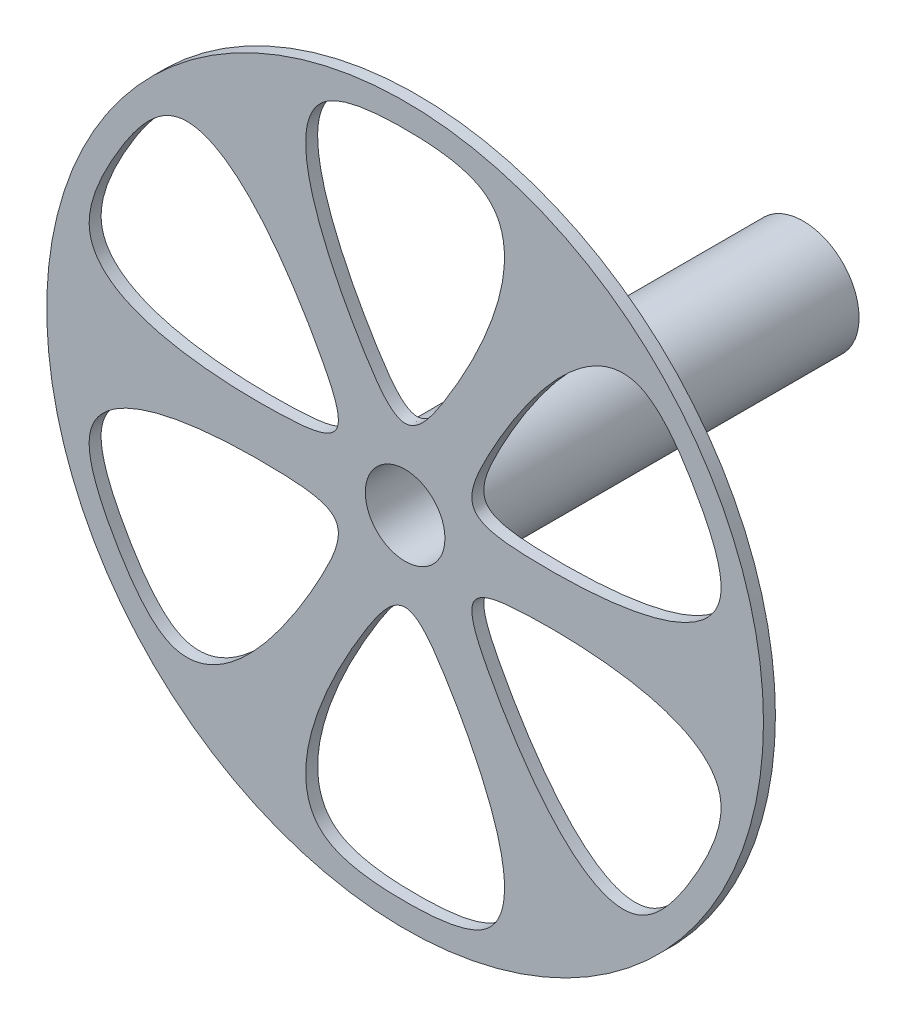
ISO-10303-21;
HEADER;
FILE_DESCRIPTION(('STEP AP214'),'2;1');
FILE_NAME('part.step','',(''),(''),'','','');
FILE_SCHEMA(('AUTOMOTIVE_DESIGN { 1 0 10303 214 1 1 1 1 }'));
ENDSEC;
DATA;
#1=APPLICATION_CONTEXT('core data for automotive mechanical design processes');
#2=APPLICATION_PROTOCOL_DEFINITION('international standard','automotive_design',2000,#1);
#3=PRODUCT_CONTEXT('',#1,'mechanical');
#4=PRODUCT('Part','Part','',(#3));
#5=PRODUCT_RELATED_PRODUCT_CATEGORY('part','',(#4));
#6=PRODUCT_DEFINITION_FORMATION('','',#4);
#7=PRODUCT_DEFINITION_CONTEXT('part definition',#1,'design');
#8=PRODUCT_DEFINITION('design','',#6,#7);
#9=PRODUCT_DEFINITION_SHAPE('','',#8);
#10=(LENGTH_UNIT() NAMED_UNIT(*) SI_UNIT(.MILLI.,.METRE.));
#11=(NAMED_UNIT(*) PLANE_ANGLE_UNIT() SI_UNIT($,.RADIAN.));
#12=(NAMED_UNIT(*) SI_UNIT($,.STERADIAN.) SOLID_ANGLE_UNIT());
#13=UNCERTAINTY_MEASURE_WITH_UNIT(LENGTH_MEASURE(1.E-05),#10,'distance_accuracy_value','');
#14=(GEOMETRIC_REPRESENTATION_CONTEXT(3) GLOBAL_UNCERTAINTY_ASSIGNED_CONTEXT((#13)) GLOBAL_UNIT_ASSIGNED_CONTEXT((#10,
#11,#12)) REPRESENTATION_CONTEXT('',''));
#15=CARTESIAN_POINT('',(0.,0.,0.));
#16=DIRECTION('',(0.,0.,1.));
#17=DIRECTION('',(1.,0.,0.));
#18=AXIS2_PLACEMENT_3D('',#15,#16,#17);
#19=CARTESIAN_POINT('',(0.,0.,1.5));
#20=DIRECTION('',(0.,0.,1.));
#21=DIRECTION('',(1.,0.,0.));
#22=AXIS2_PLACEMENT_3D('',#19,#20,#21);
#23=PLANE('',#22);
#24=CARTESIAN_POINT('',(-10.4903810567667,-11.8301270189221,1.5));
#25=CARTESIAN_POINT('',(-9.05477046402168,-9.13911477379897,1.5));
#26=CARTESIAN_POINT('',(-6.57207744656679,-3.79439068291032,1.5));
#27=CARTESIAN_POINT('',(-23.0244078505378,-2.33053790081409,1.5));
#28=CARTESIAN_POINT('',(-43.9299827972438,-5.17744423737369,1.5));
#29=CARTESIAN_POINT('',(-36.7112614569157,-21.1952566844406,1.5));
#30=CARTESIAN_POINT('',(-26.4487896348655,-35.4557589715392,1.5));
#31=CARTESIAN_POINT('',(-15.6665486605081,-21.532709651615,1.5));
#32=CARTESIAN_POINT('',(-10.4903810567667,-11.8301270189221,1.5));
#33=B_SPLINE_CURVE_WITH_KNOTS('',3,(#24,#25,#26,#27,#28,#29,#30,#31,#32),.UNSPECIFIED.,.T.,.F.,
(4,1,1,1,1,1,4),(0.,0.0826750773212742,0.165350154642548,0.463439385127353,0.582675077321274,
0.701910769515196,1.),.UNSPECIFIED.);
#34=CARTESIAN_POINT('',(-10.4903810567667,-11.8301270189221,1.5));
#35=VERTEX_POINT('',#34);
#36=EDGE_CURVE('E135',#35,#35,#33,.T.);
#37=ORIENTED_EDGE('',*,*,#36,.F.);
#38=EDGE_LOOP('',(#37));
#39=FACE_BOUND('',#38,.T.);
#40=CARTESIAN_POINT('',(15.4903810567666,-3.16987298107788,1.5));
#41=CARTESIAN_POINT('',(12.4420907942224,-3.27210386038024,1.5));
#42=CARTESIAN_POINT('',(6.57207744656673,-3.79439068291042,1.5));
#43=CARTESIAN_POINT('',(13.5305089518564,-18.7744531552525,1.5));
#44=CARTESIAN_POINT('',(26.448789634865,-35.4557589715396,1.5));
#45=CARTESIAN_POINT('',(36.7112614569155,-21.1952566844411,1.5));
#46=CARTESIAN_POINT('',(43.9299827972438,-5.1774442373743,1.5));
#47=CARTESIAN_POINT('',(26.481147900867,-2.80127430381743,1.5));
#48=CARTESIAN_POINT('',(15.4903810567666,-3.16987298107788,1.5));
#49=B_SPLINE_CURVE_WITH_KNOTS('',3,(#40,#41,#42,#43,#44,#45,#46,#47,#48),.UNSPECIFIED.,.T.,.F.,
(4,1,1,1,1,1,4),(0.,0.0826750773212742,0.165350154642548,0.463439385127353,0.582675077321274,
0.701910769515196,1.),.UNSPECIFIED.);
#50=CARTESIAN_POINT('',(15.4903810567666,-3.16987298107788,1.5));
#51=VERTEX_POINT('',#50);
#52=EDGE_CURVE('E178',#51,#51,#49,.T.);
#53=ORIENTED_EDGE('',*,*,#52,.F.);
#54=EDGE_LOOP('',(#53));
#55=FACE_BOUND('',#54,.T.);
#56=CARTESIAN_POINT('',(0.,0.,1.5));
#57=DIRECTION('',(0.,0.,1.));
#58=DIRECTION('',(1.,0.,0.));
#59=AXIS2_PLACEMENT_3D('',#56,#57,#58);
#60=CIRCLE('',#59,45.);
#61=CARTESIAN_POINT('',(45.,0.,1.5));
#62=VERTEX_POINT('',#61);
#63=EDGE_CURVE('E10',#62,#62,#60,.T.);
#64=ORIENTED_EDGE('',*,*,#63,.T.);
#65=EDGE_LOOP('',(#64));
#66=FACE_BOUND('',#65,.T.);
#67=CARTESIAN_POINT('',(-5.,15.,1.5));
#68=CARTESIAN_POINT('',(-3.38732033020086,12.4112186341792,1.5));
#69=CARTESIAN_POINT('',(0.,7.58878136582076,1.5));
#70=CARTESIAN_POINT('',(9.49389889868125,21.1049910560667,1.5));
#71=CARTESIAN_POINT('',(17.4811931623786,40.6332032089135,1.5));
#72=CARTESIAN_POINT('',(0.,42.3905133688819,1.5));
#73=CARTESIAN_POINT('',(-17.4811931623786,40.6332032089135,1.5));
#74=CARTESIAN_POINT('',(-10.8145992403592,24.3339839554325,1.5));
#75=CARTESIAN_POINT('',(-5.,15.,1.5));
#76=B_SPLINE_CURVE_WITH_KNOTS('',3,(#67,#68,#69,#70,#71,#72,#73,#74,#75),.UNSPECIFIED.,.T.,.F.,
(4,1,1,1,1,1,4),(0.,0.0826750773212742,0.165350154642548,0.463439385127353,0.582675077321274,
0.701910769515196,1.),.UNSPECIFIED.);
#77=CARTESIAN_POINT('',(-5.,15.,1.5));
#78=VERTEX_POINT('',#77);
#79=EDGE_CURVE('E54',#78,#78,#76,.T.);
#80=ORIENTED_EDGE('',*,*,#79,.F.);
#81=EDGE_LOOP('',(#80));
#82=FACE_BOUND('',#81,.T.);
#83=CARTESIAN_POINT('',(10.4903810567666,11.8301270189222,1.5));
#84=CARTESIAN_POINT('',(9.05477046402162,9.13911477379903,1.5));
#85=CARTESIAN_POINT('',(6.57207744656676,3.79439068291036,1.5));
#86=CARTESIAN_POINT('',(23.0244078505378,2.33053790081425,1.5));
#87=CARTESIAN_POINT('',(43.9299827972438,5.17744423737399,1.5));
#88=CARTESIAN_POINT('',(36.7112614569156,21.1952566844409,1.5));
#89=CARTESIAN_POINT('',(26.4487896348653,35.4557589715394,1.5));
#90=CARTESIAN_POINT('',(15.6665486605079,21.5327096516151,1.5));
#91=CARTESIAN_POINT('',(10.4903810567666,11.8301270189222,1.5));
#92=B_SPLINE_CURVE_WITH_KNOTS('',3,(#83,#84,#85,#86,#87,#88,#89,#90,#91),.UNSPECIFIED.,.T.,.F.,
(4,1,1,1,1,1,4),(0.,0.0826750773212742,0.165350154642548,0.463439385127353,0.582675077321274,
0.701910769515196,1.),.UNSPECIFIED.);
#93=CARTESIAN_POINT('',(10.4903810567666,11.8301270189222,1.5));
#94=VERTEX_POINT('',#93);
#95=EDGE_CURVE('E195',#94,#94,#92,.T.);
#96=ORIENTED_EDGE('',*,*,#95,.F.);
#97=EDGE_LOOP('',(#96));
#98=FACE_BOUND('',#97,.T.);
#99=CARTESIAN_POINT('',(4.9999999999999,-15.,1.5));
#100=CARTESIAN_POINT('',(3.38732033020077,-12.4112186341793,1.5));
#101=CARTESIAN_POINT('',(0.,-7.58878136582076,1.5));
#102=CARTESIAN_POINT('',(-9.4938988986814,-21.1049910560667,1.5));
#103=CARTESIAN_POINT('',(-17.4811931623788,-40.6332032089134,1.5));
#104=CARTESIAN_POINT('',(-2.90428867577067E-13,-42.3905133688819,1.5));
#105=CARTESIAN_POINT('',(17.4811931623783,-40.6332032089136,1.5));
#106=CARTESIAN_POINT('',(10.814599240359,-24.3339839554325,1.5));
#107=CARTESIAN_POINT('',(4.9999999999999,-15.,1.5));
#108=B_SPLINE_CURVE_WITH_KNOTS('',3,(#99,#100,#101,#102,#103,#104,#105,#106,#107),.UNSPECIFIED.,
.T.,.F.,(4,1,1,1,1,1,4),(0.,0.0826750773212742,0.165350154642548,0.463439385127353,
0.582675077321274,0.701910769515196,1.),.UNSPECIFIED.);
#109=CARTESIAN_POINT('',(4.9999999999999,-15.,1.5));
#110=VERTEX_POINT('',#109);
#111=EDGE_CURVE('E165',#110,#110,#108,.T.);
#112=ORIENTED_EDGE('',*,*,#111,.F.);
#113=EDGE_LOOP('',(#112));
#114=FACE_BOUND('',#113,.T.);
#115=CARTESIAN_POINT('',(-15.4903810567665,3.16987298107799,1.5));
#116=CARTESIAN_POINT('',(-12.4420907942224,3.27210386038033,1.5));
#117=CARTESIAN_POINT('',(-6.5720774465667,3.79439068291046,1.5));
#118=CARTESIAN_POINT('',(-13.5305089518563,18.7744531552526,1.5));
#119=CARTESIAN_POINT('',(-26.4487896348648,35.4557589715397,1.5));
#120=CARTESIAN_POINT('',(-36.7112614569153,21.1952566844414,1.5));
#121=CARTESIAN_POINT('',(-43.9299827972437,5.1774442373746,1.5));
#122=CARTESIAN_POINT('',(-26.481147900867,2.80127430381761,1.5));
#123=CARTESIAN_POINT('',(-15.4903810567665,3.16987298107799,1.5));
#124=B_SPLINE_CURVE_WITH_KNOTS('',3,(#115,#116,#117,#118,#119,#120,#121,#122,#123),
.UNSPECIFIED.,.T.,.F.,(4,1,1,1,1,1,4),(0.,0.0826750773212742,0.165350154642548,
0.463439385127352,0.582675077321274,0.701910769515196,1.),.UNSPECIFIED.);
#125=CARTESIAN_POINT('',(-15.4903810567665,3.16987298107799,1.5));
#126=VERTEX_POINT('',#125);
#127=EDGE_CURVE('E121',#126,#126,#124,.T.);
#128=ORIENTED_EDGE('',*,*,#127,.F.);
#129=EDGE_LOOP('',(#128));
#130=FACE_BOUND('',#129,.T.);
#131=CARTESIAN_POINT('',(0.,0.,1.5));
#132=DIRECTION('',(0.,0.,1.));
#133=DIRECTION('',(1.,0.,0.));
#134=AXIS2_PLACEMENT_3D('',#131,#132,#133);
#135=CIRCLE('',#134,5.);
#136=CARTESIAN_POINT('',(5.,0.,1.5));
#137=VERTEX_POINT('',#136);
#138=EDGE_CURVE('E62',#137,#137,#135,.T.);
#139=ORIENTED_EDGE('',*,*,#138,.F.);
#140=EDGE_LOOP('',(#139));
#141=FACE_BOUND('',#140,.T.);
#142=ADVANCED_FACE('F39',(#39,#55,#66,#82,#98,#114,#130,#141),#23,.T.);
#143=CARTESIAN_POINT('',(0.,0.,0.));
#144=DIRECTION('',(0.,0.,1.));
#145=DIRECTION('',(1.,0.,0.));
#146=AXIS2_PLACEMENT_3D('',#143,#144,#145);
#147=PLANE('',#146);
#148=CARTESIAN_POINT('',(0.,0.,0.));
#149=DIRECTION('',(0.,0.,1.));
#150=DIRECTION('',(1.,0.,0.));
#151=AXIS2_PLACEMENT_3D('',#148,#149,#150);
#152=CIRCLE('',#151,7.);
#153=CARTESIAN_POINT('',(7.,0.,0.));
#154=VERTEX_POINT('',#153);
#155=EDGE_CURVE('E43',#154,#154,#152,.T.);
#156=ORIENTED_EDGE('',*,*,#155,.T.);
#157=EDGE_LOOP('',(#156));
#158=FACE_BOUND('',#157,.T.);
#159=CARTESIAN_POINT('',(0.,0.,0.));
#160=DIRECTION('',(0.,0.,1.));
#161=DIRECTION('',(1.,0.,0.));
#162=AXIS2_PLACEMENT_3D('',#159,#160,#161);
#163=CIRCLE('',#162,45.);
#164=CARTESIAN_POINT('',(45.,0.,0.));
#165=VERTEX_POINT('',#164);
#166=EDGE_CURVE('E48',#165,#165,#163,.T.);
#167=ORIENTED_EDGE('',*,*,#166,.F.);
#168=EDGE_LOOP('',(#167));
#169=FACE_BOUND('',#168,.T.);
#170=CARTESIAN_POINT('',(-5.,15.,0.));
#171=CARTESIAN_POINT('',(-3.38732033020086,12.4112186341792,0.));
#172=CARTESIAN_POINT('',(0.,7.58878136582076,0.));
#173=CARTESIAN_POINT('',(9.49389889868125,21.1049910560667,0.));
#174=CARTESIAN_POINT('',(17.4811931623786,40.6332032089135,0.));
#175=CARTESIAN_POINT('',(0.,42.3905133688819,0.));
#176=CARTESIAN_POINT('',(-17.4811931623786,40.6332032089135,0.));
#177=CARTESIAN_POINT('',(-10.8145992403592,24.3339839554325,0.));
#178=CARTESIAN_POINT('',(-5.,15.,0.));
#179=B_SPLINE_CURVE_WITH_KNOTS('',3,(#170,#171,#172,#173,#174,#175,#176,#177,#178),
.UNSPECIFIED.,.T.,.F.,(4,1,1,1,1,1,4),(0.,0.0826750773212742,0.165350154642548,
0.463439385127353,0.582675077321274,0.701910769515196,1.),.UNSPECIFIED.);
#180=CARTESIAN_POINT('',(-5.,15.,0.));
#181=VERTEX_POINT('',#180);
#182=EDGE_CURVE('E56',#181,#181,#179,.T.);
#183=ORIENTED_EDGE('',*,*,#182,.T.);
#184=EDGE_LOOP('',(#183));
#185=FACE_BOUND('',#184,.T.);
#186=CARTESIAN_POINT('',(10.4903810567666,11.8301270189222,0.));
#187=CARTESIAN_POINT('',(9.05477046402162,9.13911477379903,0.));
#188=CARTESIAN_POINT('',(6.57207744656676,3.79439068291036,0.));
#189=CARTESIAN_POINT('',(23.0244078505378,2.33053790081425,0.));
#190=CARTESIAN_POINT('',(43.9299827972438,5.17744423737399,0.));
#191=CARTESIAN_POINT('',(36.7112614569156,21.1952566844409,0.));
#192=CARTESIAN_POINT('',(26.4487896348653,35.4557589715394,0.));
#193=CARTESIAN_POINT('',(15.6665486605079,21.5327096516151,0.));
#194=CARTESIAN_POINT('',(10.4903810567666,11.8301270189222,0.));
#195=B_SPLINE_CURVE_WITH_KNOTS('',3,(#186,#187,#188,#189,#190,#191,#192,#193,#194),
.UNSPECIFIED.,.T.,.F.,(4,1,1,1,1,1,4),(0.,0.0826750773212742,0.165350154642548,
0.463439385127353,0.582675077321274,0.701910769515196,1.),.UNSPECIFIED.);
#196=CARTESIAN_POINT('',(10.4903810567666,11.8301270189222,0.));
#197=VERTEX_POINT('',#196);
#198=EDGE_CURVE('E103',#197,#197,#195,.T.);
#199=ORIENTED_EDGE('',*,*,#198,.T.);
#200=EDGE_LOOP('',(#199));
#201=FACE_BOUND('',#200,.T.);
#202=CARTESIAN_POINT('',(15.4903810567666,-3.16987298107788,0.));
#203=CARTESIAN_POINT('',(12.4420907942224,-3.27210386038024,0.));
#204=CARTESIAN_POINT('',(6.57207744656673,-3.79439068291042,0.));
#205=CARTESIAN_POINT('',(13.5305089518564,-18.7744531552525,0.));
#206=CARTESIAN_POINT('',(26.448789634865,-35.4557589715396,0.));
#207=CARTESIAN_POINT('',(36.7112614569155,-21.1952566844411,0.));
#208=CARTESIAN_POINT('',(43.9299827972438,-5.1774442373743,0.));
#209=CARTESIAN_POINT('',(26.481147900867,-2.80127430381743,0.));
#210=CARTESIAN_POINT('',(15.4903810567666,-3.16987298107788,0.));
#211=B_SPLINE_CURVE_WITH_KNOTS('',3,(#202,#203,#204,#205,#206,#207,#208,#209,#210),
.UNSPECIFIED.,.T.,.F.,(4,1,1,1,1,1,4),(0.,0.0826750773212742,0.165350154642548,
0.463439385127353,0.582675077321274,0.701910769515196,1.),.UNSPECIFIED.);
#212=CARTESIAN_POINT('',(15.4903810567666,-3.16987298107788,0.));
#213=VERTEX_POINT('',#212);
#214=EDGE_CURVE('E107',#213,#213,#211,.T.);
#215=ORIENTED_EDGE('',*,*,#214,.T.);
#216=EDGE_LOOP('',(#215));
#217=FACE_BOUND('',#216,.T.);
#218=CARTESIAN_POINT('',(4.9999999999999,-15.,0.));
#219=CARTESIAN_POINT('',(3.38732033020077,-12.4112186341793,0.));
#220=CARTESIAN_POINT('',(0.,-7.58878136582076,0.));
#221=CARTESIAN_POINT('',(-9.4938988986814,-21.1049910560667,0.));
#222=CARTESIAN_POINT('',(-17.4811931623788,-40.6332032089134,0.));
#223=CARTESIAN_POINT('',(-2.90428867577067E-13,-42.3905133688819,0.));
#224=CARTESIAN_POINT('',(17.4811931623783,-40.6332032089136,0.));
#225=CARTESIAN_POINT('',(10.814599240359,-24.3339839554325,0.));
#226=CARTESIAN_POINT('',(4.9999999999999,-15.,0.));
#227=B_SPLINE_CURVE_WITH_KNOTS('',3,(#218,#219,#220,#221,#222,#223,#224,#225,#226),
.UNSPECIFIED.,.T.,.F.,(4,1,1,1,1,1,4),(0.,0.0826750773212742,0.165350154642548,
0.463439385127353,0.582675077321274,0.701910769515196,1.),.UNSPECIFIED.);
#228=CARTESIAN_POINT('',(4.9999999999999,-15.,0.));
#229=VERTEX_POINT('',#228);
#230=EDGE_CURVE('E111',#229,#229,#227,.T.);
#231=ORIENTED_EDGE('',*,*,#230,.T.);
#232=EDGE_LOOP('',(#231));
#233=FACE_BOUND('',#232,.T.);
#234=CARTESIAN_POINT('',(-10.4903810567667,-11.8301270189221,0.));
#235=CARTESIAN_POINT('',(-9.05477046402168,-9.13911477379897,0.));
#236=CARTESIAN_POINT('',(-6.57207744656679,-3.79439068291032,0.));
#237=CARTESIAN_POINT('',(-23.0244078505378,-2.33053790081409,0.));
#238=CARTESIAN_POINT('',(-43.9299827972438,-5.17744423737369,0.));
#239=CARTESIAN_POINT('',(-36.7112614569157,-21.1952566844406,0.));
#240=CARTESIAN_POINT('',(-26.4487896348655,-35.4557589715392,0.));
#241=CARTESIAN_POINT('',(-15.6665486605081,-21.532709651615,0.));
#242=CARTESIAN_POINT('',(-10.4903810567667,-11.8301270189221,0.));
#243=B_SPLINE_CURVE_WITH_KNOTS('',3,(#234,#235,#236,#237,#238,#239,#240,#241,#242),
.UNSPECIFIED.,.T.,.F.,(4,1,1,1,1,1,4),(0.,0.0826750773212742,0.165350154642548,
0.463439385127353,0.582675077321274,0.701910769515196,1.),.UNSPECIFIED.);
#244=CARTESIAN_POINT('',(-10.4903810567667,-11.8301270189221,0.));
#245=VERTEX_POINT('',#244);
#246=EDGE_CURVE('E115',#245,#245,#243,.T.);
#247=ORIENTED_EDGE('',*,*,#246,.T.);
#248=EDGE_LOOP('',(#247));
#249=FACE_BOUND('',#248,.T.);
#250=CARTESIAN_POINT('',(-15.4903810567665,3.16987298107799,0.));
#251=CARTESIAN_POINT('',(-12.4420907942224,3.27210386038033,0.));
#252=CARTESIAN_POINT('',(-6.5720774465667,3.79439068291046,0.));
#253=CARTESIAN_POINT('',(-13.5305089518563,18.7744531552526,0.));
#254=CARTESIAN_POINT('',(-26.4487896348648,35.4557589715397,0.));
#255=CARTESIAN_POINT('',(-36.7112614569153,21.1952566844414,0.));
#256=CARTESIAN_POINT('',(-43.9299827972437,5.1774442373746,0.));
#257=CARTESIAN_POINT('',(-26.481147900867,2.80127430381761,0.));
#258=CARTESIAN_POINT('',(-15.4903810567665,3.16987298107799,0.));
#259=B_SPLINE_CURVE_WITH_KNOTS('',3,(#250,#251,#252,#253,#254,#255,#256,#257,#258),
.UNSPECIFIED.,.T.,.F.,(4,1,1,1,1,1,4),(0.,0.0826750773212742,0.165350154642548,
0.463439385127352,0.582675077321274,0.701910769515196,1.),.UNSPECIFIED.);
#260=CARTESIAN_POINT('',(-15.4903810567665,3.16987298107799,0.));
#261=VERTEX_POINT('',#260);
#262=EDGE_CURVE('E118',#261,#261,#259,.T.);
#263=ORIENTED_EDGE('',*,*,#262,.T.);
#264=EDGE_LOOP('',(#263));
#265=FACE_BOUND('',#264,.T.);
#266=ADVANCED_FACE('F85',(#158,#169,#185,#201,#217,#233,#249,#265),#147,.F.);
#267=CARTESIAN_POINT('',(0.,0.,1.5));
#268=DIRECTION('',(0.,0.,-1.));
#269=DIRECTION('',(-1.,0.,0.));
#270=AXIS2_PLACEMENT_3D('',#267,#268,#269);
#271=CYLINDRICAL_SURFACE('',#270,45.);
#272=ORIENTED_EDGE('',*,*,#63,.F.);
#273=EDGE_LOOP('',(#272));
#274=FACE_BOUND('',#273,.T.);
#275=ORIENTED_EDGE('',*,*,#166,.T.);
#276=EDGE_LOOP('',(#275));
#277=FACE_BOUND('',#276,.T.);
#278=ADVANCED_FACE('F41',(#274,#277),#271,.T.);
#279=DIRECTION('',(0.,0.,-1.));
#280=VECTOR('',#279,1.);
#281=SURFACE_OF_LINEAR_EXTRUSION('',#76,#280);
#282=ORIENTED_EDGE('',*,*,#79,.T.);
#283=EDGE_LOOP('',(#282));
#284=FACE_BOUND('',#283,.T.);
#285=ORIENTED_EDGE('',*,*,#182,.F.);
#286=EDGE_LOOP('',(#285));
#287=FACE_BOUND('',#286,.T.);
#288=ADVANCED_FACE('F77',(#284,#287),#281,.T.);
#289=CARTESIAN_POINT('',(0.,0.,1.5));
#290=DIRECTION('',(0.,0.,-1.));
#291=DIRECTION('',(-1.,0.,0.));
#292=AXIS2_PLACEMENT_3D('',#289,#290,#291);
#293=CYLINDRICAL_SURFACE('',#292,5.);
#294=ORIENTED_EDGE('',*,*,#138,.T.);
#295=EDGE_LOOP('',(#294));
#296=FACE_BOUND('',#295,.T.);
#297=CARTESIAN_POINT('',(0.,0.,-48.5));
#298=DIRECTION('',(0.,0.,1.));
#299=DIRECTION('',(1.,0.,0.));
#300=AXIS2_PLACEMENT_3D('',#297,#298,#299);
#301=CIRCLE('',#300,5.);
#302=CARTESIAN_POINT('',(5.,0.,-48.5));
#303=VERTEX_POINT('',#302);
#304=EDGE_CURVE('E229',#303,#303,#301,.T.);
#305=ORIENTED_EDGE('',*,*,#304,.F.);
#306=EDGE_LOOP('',(#305));
#307=FACE_BOUND('',#306,.T.);
#308=ADVANCED_FACE('F81',(#296,#307),#293,.F.);
#309=DIRECTION('',(0.,0.,-1.));
#310=VECTOR('',#309,1.);
#311=SURFACE_OF_LINEAR_EXTRUSION('',#92,#310);
#312=ORIENTED_EDGE('',*,*,#95,.T.);
#313=EDGE_LOOP('',(#312));
#314=FACE_BOUND('',#313,.T.);
#315=ORIENTED_EDGE('',*,*,#198,.F.);
#316=EDGE_LOOP('',(#315));
#317=FACE_BOUND('',#316,.T.);
#318=ADVANCED_FACE('F209',(#314,#317),#311,.T.);
#319=DIRECTION('',(0.,0.,-1.));
#320=VECTOR('',#319,1.);
#321=SURFACE_OF_LINEAR_EXTRUSION('',#49,#320);
#322=ORIENTED_EDGE('',*,*,#52,.T.);
#323=EDGE_LOOP('',(#322));
#324=FACE_BOUND('',#323,.T.);
#325=ORIENTED_EDGE('',*,*,#214,.F.);
#326=EDGE_LOOP('',(#325));
#327=FACE_BOUND('',#326,.T.);
#328=ADVANCED_FACE('F162',(#324,#327),#321,.T.);
#329=DIRECTION('',(0.,0.,-1.));
#330=VECTOR('',#329,1.);
#331=SURFACE_OF_LINEAR_EXTRUSION('',#108,#330);
#332=ORIENTED_EDGE('',*,*,#111,.T.);
#333=EDGE_LOOP('',(#332));
#334=FACE_BOUND('',#333,.T.);
#335=ORIENTED_EDGE('',*,*,#230,.F.);
#336=EDGE_LOOP('',(#335));
#337=FACE_BOUND('',#336,.T.);
#338=ADVANCED_FACE('F157',(#334,#337),#331,.T.);
#339=DIRECTION('',(0.,0.,-1.));
#340=VECTOR('',#339,1.);
#341=SURFACE_OF_LINEAR_EXTRUSION('',#33,#340);
#342=ORIENTED_EDGE('',*,*,#36,.T.);
#343=EDGE_LOOP('',(#342));
#344=FACE_BOUND('',#343,.T.);
#345=ORIENTED_EDGE('',*,*,#246,.F.);
#346=EDGE_LOOP('',(#345));
#347=FACE_BOUND('',#346,.T.);
#348=ADVANCED_FACE('F152',(#344,#347),#341,.T.);
#349=DIRECTION('',(0.,0.,-1.));
#350=VECTOR('',#349,1.);
#351=SURFACE_OF_LINEAR_EXTRUSION('',#124,#350);
#352=ORIENTED_EDGE('',*,*,#127,.T.);
#353=EDGE_LOOP('',(#352));
#354=FACE_BOUND('',#353,.T.);
#355=ORIENTED_EDGE('',*,*,#262,.F.);
#356=EDGE_LOOP('',(#355));
#357=FACE_BOUND('',#356,.T.);
#358=ADVANCED_FACE('F156',(#354,#357),#351,.T.);
#359=CARTESIAN_POINT('',(0.,0.,-48.5));
#360=DIRECTION('',(0.,0.,1.));
#361=DIRECTION('',(1.,0.,0.));
#362=AXIS2_PLACEMENT_3D('',#359,#360,#361);
#363=CYLINDRICAL_SURFACE('',#362,7.);
#364=CARTESIAN_POINT('',(0.,0.,-48.5));
#365=DIRECTION('',(0.,0.,1.));
#366=DIRECTION('',(1.,0.,0.));
#367=AXIS2_PLACEMENT_3D('',#364,#365,#366);
#368=CIRCLE('',#367,7.);
#369=CARTESIAN_POINT('',(7.,0.,-48.5));
#370=VERTEX_POINT('',#369);
#371=EDGE_CURVE('E127',#370,#370,#368,.T.);
#372=ORIENTED_EDGE('',*,*,#371,.T.);
#373=EDGE_LOOP('',(#372));
#374=FACE_BOUND('',#373,.T.);
#375=ORIENTED_EDGE('',*,*,#155,.F.);
#376=EDGE_LOOP('',(#375));
#377=FACE_BOUND('',#376,.T.);
#378=ADVANCED_FACE('F237',(#374,#377),#363,.T.);
#379=CARTESIAN_POINT('',(0.,0.,-48.5));
#380=DIRECTION('',(0.,0.,1.));
#381=DIRECTION('',(1.,0.,0.));
#382=AXIS2_PLACEMENT_3D('',#379,#380,#381);
#383=PLANE('',#382);
#384=ORIENTED_EDGE('',*,*,#304,.T.);
#385=EDGE_LOOP('',(#384));
#386=FACE_BOUND('',#385,.T.);
#387=ORIENTED_EDGE('',*,*,#371,.F.);
#388=EDGE_LOOP('',(#387));
#389=FACE_BOUND('',#388,.T.);
#390=ADVANCED_FACE('F240',(#386,#389),#383,.F.);
#391=CLOSED_SHELL('',(#142,#266,#278,#288,#308,#318,#328,#338,#348,#358,#378,#390));
#392=MANIFOLD_SOLID_BREP('B2',#391);
#393=ADVANCED_BREP_SHAPE_REPRESENTATION('',(#18,#392),#14);
#394=SHAPE_DEFINITION_REPRESENTATION(#9,#393);
ENDSEC;
END-ISO-10303-21;
